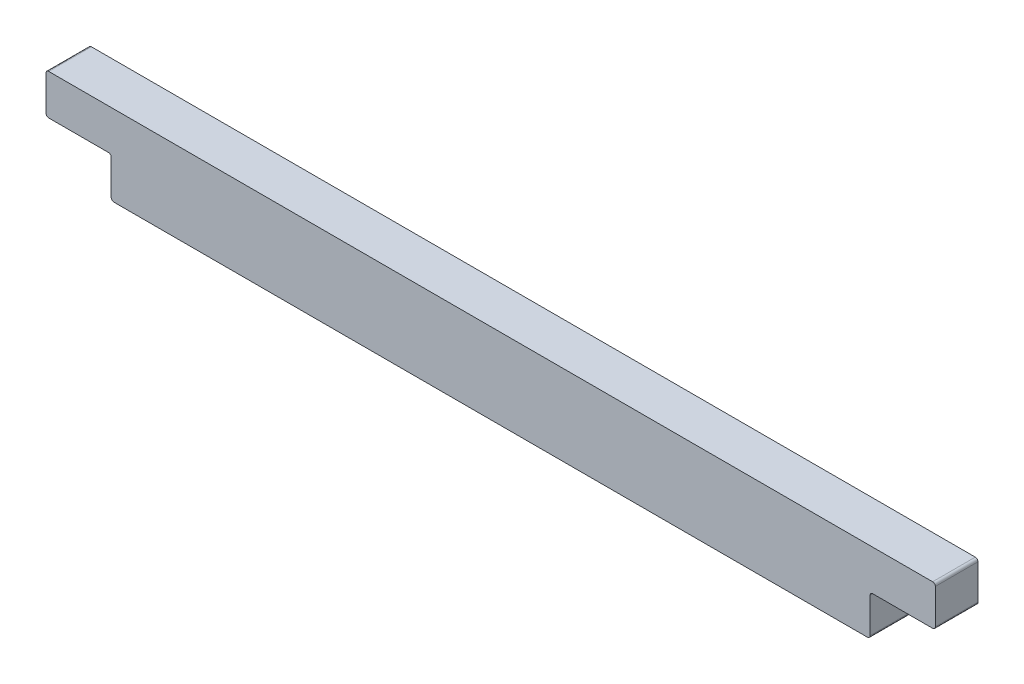
ISO-10303-21;
HEADER;
FILE_DESCRIPTION(('STEP AP214'),'2;1');
FILE_NAME('part.step','',(''),(''),'','','');
FILE_SCHEMA(('AUTOMOTIVE_DESIGN { 1 0 10303 214 1 1 1 1 }'));
ENDSEC;
DATA;
#1=APPLICATION_CONTEXT('core data for automotive mechanical design processes');
#2=APPLICATION_PROTOCOL_DEFINITION('international standard','automotive_design',2000,#1);
#3=PRODUCT_CONTEXT('',#1,'mechanical');
#4=PRODUCT('Part','Part','',(#3));
#5=PRODUCT_RELATED_PRODUCT_CATEGORY('part','',(#4));
#6=PRODUCT_DEFINITION_FORMATION('','',#4);
#7=PRODUCT_DEFINITION_CONTEXT('part definition',#1,'design');
#8=PRODUCT_DEFINITION('design','',#6,#7);
#9=PRODUCT_DEFINITION_SHAPE('','',#8);
#10=(LENGTH_UNIT() NAMED_UNIT(*) SI_UNIT(.MILLI.,.METRE.));
#11=(NAMED_UNIT(*) PLANE_ANGLE_UNIT() SI_UNIT($,.RADIAN.));
#12=(NAMED_UNIT(*) SI_UNIT($,.STERADIAN.) SOLID_ANGLE_UNIT());
#13=UNCERTAINTY_MEASURE_WITH_UNIT(LENGTH_MEASURE(1.E-05),#10,'distance_accuracy_value','');
#14=(GEOMETRIC_REPRESENTATION_CONTEXT(3) GLOBAL_UNCERTAINTY_ASSIGNED_CONTEXT((#13)) GLOBAL_UNIT_ASSIGNED_CONTEXT((#10,
#11,#12)) REPRESENTATION_CONTEXT('',''));
#15=CARTESIAN_POINT('',(0.,0.,0.));
#16=DIRECTION('',(0.,0.,1.));
#17=DIRECTION('',(1.,0.,0.));
#18=AXIS2_PLACEMENT_3D('',#15,#16,#17);
#19=CARTESIAN_POINT('',(33.08,-3.,3.175));
#20=DIRECTION('',(-1.,0.,0.));
#21=DIRECTION('',(0.,0.,1.));
#22=AXIS2_PLACEMENT_3D('',#19,#20,#21);
#23=PLANE('',#22);
#24=DIRECTION('',(0.,1.,0.));
#25=VECTOR('',#24,1.);
#26=CARTESIAN_POINT('',(33.08,-3.,3.175));
#27=LINE('',#26,#25);
#28=CARTESIAN_POINT('',(33.08,0.199999999999999,3.175));
#29=VERTEX_POINT('',#28);
#30=CARTESIAN_POINT('',(33.08,2.8,3.175));
#31=VERTEX_POINT('',#30);
#32=EDGE_CURVE('E190',#29,#31,#27,.T.);
#33=ORIENTED_EDGE('',*,*,#32,.F.);
#34=DIRECTION('',(0.,0.,1.));
#35=VECTOR('',#34,1.);
#36=CARTESIAN_POINT('',(33.08,0.199999999999999,3.175));
#37=LINE('',#36,#35);
#38=CARTESIAN_POINT('',(33.08,0.199999999999999,0.));
#39=VERTEX_POINT('',#38);
#40=EDGE_CURVE('E256',#29,#39,#37,.F.);
#41=ORIENTED_EDGE('',*,*,#40,.T.);
#42=DIRECTION('',(0.,1.,0.));
#43=VECTOR('',#42,1.);
#44=CARTESIAN_POINT('',(33.08,-3.,0.));
#45=LINE('',#44,#43);
#46=CARTESIAN_POINT('',(33.08,2.8,0.));
#47=VERTEX_POINT('',#46);
#48=EDGE_CURVE('E202',#39,#47,#45,.T.);
#49=ORIENTED_EDGE('',*,*,#48,.T.);
#50=DIRECTION('',(0.,0.,-1.));
#51=VECTOR('',#50,1.);
#52=CARTESIAN_POINT('',(33.08,2.8,3.175));
#53=LINE('',#52,#51);
#54=EDGE_CURVE('E254',#47,#31,#53,.F.);
#55=ORIENTED_EDGE('',*,*,#54,.T.);
#56=EDGE_LOOP('',(#33,#41,#49,#55));
#57=FACE_BOUND('',#56,.T.);
#58=ADVANCED_FACE('F33',(#57),#23,.F.);
#59=CARTESIAN_POINT('',(-33.08,3.,3.175));
#60=DIRECTION('',(0.,-1.,0.));
#61=DIRECTION('',(0.,0.,-1.));
#62=AXIS2_PLACEMENT_3D('',#59,#60,#61);
#63=PLANE('',#62);
#64=DIRECTION('',(-1.,0.,0.));
#65=VECTOR('',#64,1.);
#66=CARTESIAN_POINT('',(-33.08,3.,3.175));
#67=LINE('',#66,#65);
#68=CARTESIAN_POINT('',(32.88,3.,3.175));
#69=VERTEX_POINT('',#68);
#70=CARTESIAN_POINT('',(-32.88,3.,3.175));
#71=VERTEX_POINT('',#70);
#72=EDGE_CURVE('E193',#69,#71,#67,.T.);
#73=ORIENTED_EDGE('',*,*,#72,.F.);
#74=DIRECTION('',(0.,0.,-1.));
#75=VECTOR('',#74,1.);
#76=CARTESIAN_POINT('',(32.88,3.,3.175));
#77=LINE('',#76,#75);
#78=CARTESIAN_POINT('',(32.88,3.,0.));
#79=VERTEX_POINT('',#78);
#80=EDGE_CURVE('E260',#69,#79,#77,.T.);
#81=ORIENTED_EDGE('',*,*,#80,.T.);
#82=DIRECTION('',(-1.,0.,0.));
#83=VECTOR('',#82,1.);
#84=CARTESIAN_POINT('',(-33.08,3.,0.));
#85=LINE('',#84,#83);
#86=CARTESIAN_POINT('',(-32.88,3.,0.));
#87=VERTEX_POINT('',#86);
#88=EDGE_CURVE('E205',#79,#87,#85,.T.);
#89=ORIENTED_EDGE('',*,*,#88,.T.);
#90=DIRECTION('',(0.,0.,-1.));
#91=VECTOR('',#90,1.);
#92=CARTESIAN_POINT('',(-32.88,3.,3.175));
#93=LINE('',#92,#91);
#94=EDGE_CURVE('E258',#87,#71,#93,.F.);
#95=ORIENTED_EDGE('',*,*,#94,.T.);
#96=EDGE_LOOP('',(#73,#81,#89,#95));
#97=FACE_BOUND('',#96,.T.);
#98=ADVANCED_FACE('F311',(#97),#63,.F.);
#99=CARTESIAN_POINT('',(-33.08,-3.,3.175));
#100=DIRECTION('',(1.,0.,0.));
#101=DIRECTION('',(0.,0.,-1.));
#102=AXIS2_PLACEMENT_3D('',#99,#100,#101);
#103=PLANE('',#102);
#104=DIRECTION('',(0.,-1.,0.));
#105=VECTOR('',#104,1.);
#106=CARTESIAN_POINT('',(-33.08,-3.,3.175));
#107=LINE('',#106,#105);
#108=CARTESIAN_POINT('',(-33.08,2.8,3.175));
#109=VERTEX_POINT('',#108);
#110=CARTESIAN_POINT('',(-33.08,0.2,3.175));
#111=VERTEX_POINT('',#110);
#112=EDGE_CURVE('E197',#109,#111,#107,.T.);
#113=ORIENTED_EDGE('',*,*,#112,.F.);
#114=DIRECTION('',(0.,0.,-1.));
#115=VECTOR('',#114,1.);
#116=CARTESIAN_POINT('',(-33.08,2.8,3.175));
#117=LINE('',#116,#115);
#118=CARTESIAN_POINT('',(-33.08,2.8,0.));
#119=VERTEX_POINT('',#118);
#120=EDGE_CURVE('E157',#109,#119,#117,.T.);
#121=ORIENTED_EDGE('',*,*,#120,.T.);
#122=DIRECTION('',(0.,-1.,0.));
#123=VECTOR('',#122,1.);
#124=CARTESIAN_POINT('',(-33.08,-3.,0.));
#125=LINE('',#124,#123);
#126=CARTESIAN_POINT('',(-33.08,0.2,0.));
#127=VERTEX_POINT('',#126);
#128=EDGE_CURVE('E208',#119,#127,#125,.T.);
#129=ORIENTED_EDGE('',*,*,#128,.T.);
#130=DIRECTION('',(0.,0.,1.));
#131=VECTOR('',#130,1.);
#132=CARTESIAN_POINT('',(-33.08,0.2,3.175));
#133=LINE('',#132,#131);
#134=EDGE_CURVE('E263',#127,#111,#133,.T.);
#135=ORIENTED_EDGE('',*,*,#134,.T.);
#136=EDGE_LOOP('',(#113,#121,#129,#135));
#137=FACE_BOUND('',#136,.T.);
#138=ADVANCED_FACE('F302',(#137),#103,.F.);
#139=CARTESIAN_POINT('',(-33.08,-3.,3.175));
#140=DIRECTION('',(0.,1.,0.));
#141=DIRECTION('',(0.,0.,1.));
#142=AXIS2_PLACEMENT_3D('',#139,#140,#141);
#143=PLANE('',#142);
#144=DIRECTION('',(1.,0.,0.));
#145=VECTOR('',#144,1.);
#146=CARTESIAN_POINT('',(-33.08,-3.,3.175));
#147=LINE('',#146,#145);
#148=CARTESIAN_POINT('',(-28.03,-3.,3.175));
#149=VERTEX_POINT('',#148);
#150=CARTESIAN_POINT('',(28.03,-3.,3.175));
#151=VERTEX_POINT('',#150);
#152=EDGE_CURVE('E199',#149,#151,#147,.T.);
#153=ORIENTED_EDGE('',*,*,#152,.F.);
#154=DIRECTION('',(0.,0.,1.));
#155=VECTOR('',#154,1.);
#156=CARTESIAN_POINT('',(-28.03,-3.,3.175));
#157=LINE('',#156,#155);
#158=CARTESIAN_POINT('',(-28.03,-3.,0.));
#159=VERTEX_POINT('',#158);
#160=EDGE_CURVE('E231',#149,#159,#157,.F.);
#161=ORIENTED_EDGE('',*,*,#160,.T.);
#162=DIRECTION('',(1.,0.,0.));
#163=VECTOR('',#162,1.);
#164=CARTESIAN_POINT('',(-33.08,-3.,0.));
#165=LINE('',#164,#163);
#166=CARTESIAN_POINT('',(28.03,-3.,0.));
#167=VERTEX_POINT('',#166);
#168=EDGE_CURVE('E194',#159,#167,#165,.T.);
#169=ORIENTED_EDGE('',*,*,#168,.T.);
#170=DIRECTION('',(0.,0.,1.));
#171=VECTOR('',#170,1.);
#172=CARTESIAN_POINT('',(28.03,-3.,3.175));
#173=LINE('',#172,#171);
#174=EDGE_CURVE('E228',#167,#151,#173,.T.);
#175=ORIENTED_EDGE('',*,*,#174,.T.);
#176=EDGE_LOOP('',(#153,#161,#169,#175));
#177=FACE_BOUND('',#176,.T.);
#178=ADVANCED_FACE('F286',(#177),#143,.F.);
#179=CARTESIAN_POINT('',(0.,0.,3.175));
#180=DIRECTION('',(0.,0.,-1.));
#181=DIRECTION('',(-1.,0.,0.));
#182=AXIS2_PLACEMENT_3D('',#179,#180,#181);
#183=PLANE('',#182);
#184=DIRECTION('',(0.,1.,0.));
#185=VECTOR('',#184,1.);
#186=CARTESIAN_POINT('',(-28.23,-3.,3.175));
#187=LINE('',#186,#185);
#188=CARTESIAN_POINT('',(-28.23,-2.8,3.175));
#189=VERTEX_POINT('',#188);
#190=CARTESIAN_POINT('',(-28.23,-0.200000000000001,3.175));
#191=VERTEX_POINT('',#190);
#192=EDGE_CURVE('E174',#189,#191,#187,.T.);
#193=ORIENTED_EDGE('',*,*,#192,.F.);
#194=CARTESIAN_POINT('',(-28.03,-2.8,3.175));
#195=DIRECTION('',(0.,0.,-1.));
#196=DIRECTION('',(-1.,0.,0.));
#197=AXIS2_PLACEMENT_3D('',#194,#195,#196);
#198=CIRCLE('',#197,0.2);
#199=EDGE_CURVE('E226',#189,#149,#198,.F.);
#200=ORIENTED_EDGE('',*,*,#199,.T.);
#201=ORIENTED_EDGE('',*,*,#152,.T.);
#202=CARTESIAN_POINT('',(28.03,-2.8,3.175));
#203=DIRECTION('',(0.,0.,-1.));
#204=DIRECTION('',(-1.,0.,0.));
#205=AXIS2_PLACEMENT_3D('',#202,#203,#204);
#206=CIRCLE('',#205,0.2);
#207=CARTESIAN_POINT('',(28.23,-2.8,3.175));
#208=VERTEX_POINT('',#207);
#209=EDGE_CURVE('E217',#151,#208,#206,.F.);
#210=ORIENTED_EDGE('',*,*,#209,.T.);
#211=DIRECTION('',(0.,-1.,0.));
#212=VECTOR('',#211,1.);
#213=CARTESIAN_POINT('',(28.23,-3.,3.175));
#214=LINE('',#213,#212);
#215=CARTESIAN_POINT('',(28.23,-0.200000000000001,3.175));
#216=VERTEX_POINT('',#215);
#217=EDGE_CURVE('E184',#216,#208,#214,.T.);
#218=ORIENTED_EDGE('',*,*,#217,.F.);
#219=CARTESIAN_POINT('',(28.43,-0.200000000000001,3.175));
#220=DIRECTION('',(0.,0.,-1.));
#221=DIRECTION('',(-1.,0.,0.));
#222=AXIS2_PLACEMENT_3D('',#219,#220,#221);
#223=CIRCLE('',#222,0.2);
#224=CARTESIAN_POINT('',(28.43,0.,3.175));
#225=VERTEX_POINT('',#224);
#226=EDGE_CURVE('E41',#216,#225,#223,.T.);
#227=ORIENTED_EDGE('',*,*,#226,.T.);
#228=DIRECTION('',(-1.,0.,0.));
#229=VECTOR('',#228,1.);
#230=CARTESIAN_POINT('',(33.08,0.,3.175));
#231=LINE('',#230,#229);
#232=CARTESIAN_POINT('',(32.88,0.,3.175));
#233=VERTEX_POINT('',#232);
#234=EDGE_CURVE('E186',#233,#225,#231,.T.);
#235=ORIENTED_EDGE('',*,*,#234,.F.);
#236=CARTESIAN_POINT('',(32.88,0.199999999999999,3.175));
#237=DIRECTION('',(0.,0.,-1.));
#238=DIRECTION('',(-1.,0.,0.));
#239=AXIS2_PLACEMENT_3D('',#236,#237,#238);
#240=CIRCLE('',#239,0.2);
#241=EDGE_CURVE('E224',#233,#29,#240,.F.);
#242=ORIENTED_EDGE('',*,*,#241,.T.);
#243=ORIENTED_EDGE('',*,*,#32,.T.);
#244=CARTESIAN_POINT('',(32.88,2.8,3.175));
#245=DIRECTION('',(0.,0.,-1.));
#246=DIRECTION('',(-1.,0.,0.));
#247=AXIS2_PLACEMENT_3D('',#244,#245,#246);
#248=CIRCLE('',#247,0.2);
#249=EDGE_CURVE('E222',#31,#69,#248,.F.);
#250=ORIENTED_EDGE('',*,*,#249,.T.);
#251=ORIENTED_EDGE('',*,*,#72,.T.);
#252=CARTESIAN_POINT('',(-32.88,2.8,3.175));
#253=DIRECTION('',(0.,0.,-1.));
#254=DIRECTION('',(-1.,0.,0.));
#255=AXIS2_PLACEMENT_3D('',#252,#253,#254);
#256=CIRCLE('',#255,0.2);
#257=EDGE_CURVE('E220',#71,#109,#256,.F.);
#258=ORIENTED_EDGE('',*,*,#257,.T.);
#259=ORIENTED_EDGE('',*,*,#112,.T.);
#260=CARTESIAN_POINT('',(-32.88,0.2,3.175));
#261=DIRECTION('',(0.,0.,-1.));
#262=DIRECTION('',(-1.,0.,0.));
#263=AXIS2_PLACEMENT_3D('',#260,#261,#262);
#264=CIRCLE('',#263,0.2);
#265=CARTESIAN_POINT('',(-32.88,0.,3.175));
#266=VERTEX_POINT('',#265);
#267=EDGE_CURVE('E172',#111,#266,#264,.F.);
#268=ORIENTED_EDGE('',*,*,#267,.T.);
#269=DIRECTION('',(-1.,0.,0.));
#270=VECTOR('',#269,1.);
#271=CARTESIAN_POINT('',(-33.08,0.,3.175));
#272=LINE('',#271,#270);
#273=CARTESIAN_POINT('',(-28.43,0.,3.175));
#274=VERTEX_POINT('',#273);
#275=EDGE_CURVE('E163',#274,#266,#272,.T.);
#276=ORIENTED_EDGE('',*,*,#275,.F.);
#277=CARTESIAN_POINT('',(-28.43,-0.2,3.175));
#278=DIRECTION('',(0.,0.,-1.));
#279=DIRECTION('',(-1.,0.,0.));
#280=AXIS2_PLACEMENT_3D('',#277,#278,#279);
#281=CIRCLE('',#280,0.2);
#282=EDGE_CURVE('E146',#274,#191,#281,.T.);
#283=ORIENTED_EDGE('',*,*,#282,.T.);
#284=EDGE_LOOP('',(#193,#200,#201,#210,#218,#227,#235,#242,#243,#250,#251,#258,#259,#268,#276,#283));
#285=FACE_BOUND('',#284,.T.);
#286=ADVANCED_FACE('F170',(#285),#183,.F.);
#287=CARTESIAN_POINT('',(0.,0.,0.));
#288=DIRECTION('',(0.,0.,-1.));
#289=DIRECTION('',(-1.,0.,0.));
#290=AXIS2_PLACEMENT_3D('',#287,#288,#289);
#291=PLANE('',#290);
#292=ORIENTED_EDGE('',*,*,#168,.F.);
#293=CARTESIAN_POINT('',(-28.03,-2.8,0.));
#294=DIRECTION('',(0.,0.,-1.));
#295=DIRECTION('',(-1.,0.,0.));
#296=AXIS2_PLACEMENT_3D('',#293,#294,#295);
#297=CIRCLE('',#296,0.2);
#298=CARTESIAN_POINT('',(-28.23,-2.8,0.));
#299=VERTEX_POINT('',#298);
#300=EDGE_CURVE('E243',#159,#299,#297,.T.);
#301=ORIENTED_EDGE('',*,*,#300,.T.);
#302=DIRECTION('',(0.,1.,0.));
#303=VECTOR('',#302,1.);
#304=CARTESIAN_POINT('',(-28.23,-3.,0.));
#305=LINE('',#304,#303);
#306=CARTESIAN_POINT('',(-28.23,-0.200000000000001,0.));
#307=VERTEX_POINT('',#306);
#308=EDGE_CURVE('E173',#299,#307,#305,.T.);
#309=ORIENTED_EDGE('',*,*,#308,.T.);
#310=CARTESIAN_POINT('',(-28.43,-0.2,0.));
#311=DIRECTION('',(0.,0.,-1.));
#312=DIRECTION('',(-1.,0.,0.));
#313=AXIS2_PLACEMENT_3D('',#310,#311,#312);
#314=CIRCLE('',#313,0.2);
#315=CARTESIAN_POINT('',(-28.43,0.,0.));
#316=VERTEX_POINT('',#315);
#317=EDGE_CURVE('E156',#307,#316,#314,.F.);
#318=ORIENTED_EDGE('',*,*,#317,.T.);
#319=DIRECTION('',(-1.,0.,0.));
#320=VECTOR('',#319,1.);
#321=CARTESIAN_POINT('',(-33.08,0.,0.));
#322=LINE('',#321,#320);
#323=CARTESIAN_POINT('',(-32.88,0.,0.));
#324=VERTEX_POINT('',#323);
#325=EDGE_CURVE('E166',#316,#324,#322,.T.);
#326=ORIENTED_EDGE('',*,*,#325,.T.);
#327=CARTESIAN_POINT('',(-32.88,0.2,0.));
#328=DIRECTION('',(0.,0.,-1.));
#329=DIRECTION('',(-1.,0.,0.));
#330=AXIS2_PLACEMENT_3D('',#327,#328,#329);
#331=CIRCLE('',#330,0.2);
#332=EDGE_CURVE('E235',#324,#127,#331,.T.);
#333=ORIENTED_EDGE('',*,*,#332,.T.);
#334=ORIENTED_EDGE('',*,*,#128,.F.);
#335=CARTESIAN_POINT('',(-32.88,2.8,0.));
#336=DIRECTION('',(0.,0.,-1.));
#337=DIRECTION('',(-1.,0.,0.));
#338=AXIS2_PLACEMENT_3D('',#335,#336,#337);
#339=CIRCLE('',#338,0.2);
#340=EDGE_CURVE('E237',#119,#87,#339,.T.);
#341=ORIENTED_EDGE('',*,*,#340,.T.);
#342=ORIENTED_EDGE('',*,*,#88,.F.);
#343=CARTESIAN_POINT('',(32.88,2.8,0.));
#344=DIRECTION('',(0.,0.,-1.));
#345=DIRECTION('',(-1.,0.,0.));
#346=AXIS2_PLACEMENT_3D('',#343,#344,#345);
#347=CIRCLE('',#346,0.2);
#348=EDGE_CURVE('E239',#79,#47,#347,.T.);
#349=ORIENTED_EDGE('',*,*,#348,.T.);
#350=ORIENTED_EDGE('',*,*,#48,.F.);
#351=CARTESIAN_POINT('',(32.88,0.199999999999999,0.));
#352=DIRECTION('',(0.,0.,-1.));
#353=DIRECTION('',(-1.,0.,0.));
#354=AXIS2_PLACEMENT_3D('',#351,#352,#353);
#355=CIRCLE('',#354,0.2);
#356=CARTESIAN_POINT('',(32.88,0.,0.));
#357=VERTEX_POINT('',#356);
#358=EDGE_CURVE('E241',#39,#357,#355,.T.);
#359=ORIENTED_EDGE('',*,*,#358,.T.);
#360=DIRECTION('',(-1.,0.,0.));
#361=VECTOR('',#360,1.);
#362=CARTESIAN_POINT('',(33.08,0.,0.));
#363=LINE('',#362,#361);
#364=CARTESIAN_POINT('',(28.43,0.,0.));
#365=VERTEX_POINT('',#364);
#366=EDGE_CURVE('E182',#357,#365,#363,.T.);
#367=ORIENTED_EDGE('',*,*,#366,.T.);
#368=CARTESIAN_POINT('',(28.43,-0.200000000000001,0.));
#369=DIRECTION('',(0.,0.,-1.));
#370=DIRECTION('',(-1.,0.,0.));
#371=AXIS2_PLACEMENT_3D('',#368,#369,#370);
#372=CIRCLE('',#371,0.2);
#373=CARTESIAN_POINT('',(28.23,-0.200000000000001,0.));
#374=VERTEX_POINT('',#373);
#375=EDGE_CURVE('E11',#365,#374,#372,.F.);
#376=ORIENTED_EDGE('',*,*,#375,.T.);
#377=DIRECTION('',(0.,-1.,0.));
#378=VECTOR('',#377,1.);
#379=CARTESIAN_POINT('',(28.23,-3.,0.));
#380=LINE('',#379,#378);
#381=CARTESIAN_POINT('',(28.23,-2.8,0.));
#382=VERTEX_POINT('',#381);
#383=EDGE_CURVE('E178',#374,#382,#380,.T.);
#384=ORIENTED_EDGE('',*,*,#383,.T.);
#385=CARTESIAN_POINT('',(28.03,-2.8,0.));
#386=DIRECTION('',(0.,0.,-1.));
#387=DIRECTION('',(-1.,0.,0.));
#388=AXIS2_PLACEMENT_3D('',#385,#386,#387);
#389=CIRCLE('',#388,0.2);
#390=EDGE_CURVE('E233',#382,#167,#389,.T.);
#391=ORIENTED_EDGE('',*,*,#390,.T.);
#392=EDGE_LOOP('',(#292,#301,#309,#318,#326,#333,#334,#341,#342,#349,#350,#359,#367,#376,#384,#391));
#393=FACE_BOUND('',#392,.T.);
#394=ADVANCED_FACE('F281',(#393),#291,.T.);
#395=CARTESIAN_POINT('',(28.23,-3.,0.));
#396=DIRECTION('',(-1.,0.,0.));
#397=DIRECTION('',(0.,0.,1.));
#398=AXIS2_PLACEMENT_3D('',#395,#396,#397);
#399=PLANE('',#398);
#400=ORIENTED_EDGE('',*,*,#383,.F.);
#401=DIRECTION('',(0.,0.,1.));
#402=VECTOR('',#401,1.);
#403=CARTESIAN_POINT('',(28.23,-0.200000000000001,3.175));
#404=LINE('',#403,#402);
#405=EDGE_CURVE('E246',#374,#216,#404,.T.);
#406=ORIENTED_EDGE('',*,*,#405,.T.);
#407=ORIENTED_EDGE('',*,*,#217,.T.);
#408=DIRECTION('',(0.,0.,1.));
#409=VECTOR('',#408,1.);
#410=CARTESIAN_POINT('',(28.23,-2.8,0.));
#411=LINE('',#410,#409);
#412=EDGE_CURVE('E48',#208,#382,#411,.F.);
#413=ORIENTED_EDGE('',*,*,#412,.T.);
#414=EDGE_LOOP('',(#400,#406,#407,#413));
#415=FACE_BOUND('',#414,.T.);
#416=ADVANCED_FACE('F278',(#415),#399,.F.);
#417=CARTESIAN_POINT('',(33.08,0.,0.));
#418=DIRECTION('',(0.,1.,0.));
#419=DIRECTION('',(-1.,0.,0.));
#420=AXIS2_PLACEMENT_3D('',#417,#418,#419);
#421=PLANE('',#420);
#422=ORIENTED_EDGE('',*,*,#234,.T.);
#423=DIRECTION('',(0.,0.,1.));
#424=VECTOR('',#423,1.);
#425=CARTESIAN_POINT('',(28.43,0.,0.));
#426=LINE('',#425,#424);
#427=EDGE_CURVE('E252',#225,#365,#426,.F.);
#428=ORIENTED_EDGE('',*,*,#427,.T.);
#429=ORIENTED_EDGE('',*,*,#366,.F.);
#430=DIRECTION('',(0.,0.,1.));
#431=VECTOR('',#430,1.);
#432=CARTESIAN_POINT('',(32.88,0.,0.));
#433=LINE('',#432,#431);
#434=EDGE_CURVE('E249',#357,#233,#433,.T.);
#435=ORIENTED_EDGE('',*,*,#434,.T.);
#436=EDGE_LOOP('',(#422,#428,#429,#435));
#437=FACE_BOUND('',#436,.T.);
#438=ADVANCED_FACE('F274',(#437),#421,.F.);
#439=CARTESIAN_POINT('',(-33.08,0.,0.));
#440=DIRECTION('',(0.,1.,0.));
#441=DIRECTION('',(-1.,0.,0.));
#442=AXIS2_PLACEMENT_3D('',#439,#440,#441);
#443=PLANE('',#442);
#444=ORIENTED_EDGE('',*,*,#325,.F.);
#445=DIRECTION('',(0.,0.,1.));
#446=VECTOR('',#445,1.);
#447=CARTESIAN_POINT('',(-28.43,0.,3.175));
#448=LINE('',#447,#446);
#449=EDGE_CURVE('E150',#316,#274,#448,.T.);
#450=ORIENTED_EDGE('',*,*,#449,.T.);
#451=ORIENTED_EDGE('',*,*,#275,.T.);
#452=DIRECTION('',(0.,0.,1.));
#453=VECTOR('',#452,1.);
#454=CARTESIAN_POINT('',(-32.88,0.,0.));
#455=LINE('',#454,#453);
#456=EDGE_CURVE('E168',#266,#324,#455,.F.);
#457=ORIENTED_EDGE('',*,*,#456,.T.);
#458=EDGE_LOOP('',(#444,#450,#451,#457));
#459=FACE_BOUND('',#458,.T.);
#460=ADVANCED_FACE('F162',(#459),#443,.F.);
#461=CARTESIAN_POINT('',(-28.23,-3.,0.));
#462=DIRECTION('',(1.,0.,0.));
#463=DIRECTION('',(0.,0.,-1.));
#464=AXIS2_PLACEMENT_3D('',#461,#462,#463);
#465=PLANE('',#464);
#466=ORIENTED_EDGE('',*,*,#192,.T.);
#467=DIRECTION('',(0.,0.,1.));
#468=VECTOR('',#467,1.);
#469=CARTESIAN_POINT('',(-28.23,-0.2,0.));
#470=LINE('',#469,#468);
#471=EDGE_CURVE('E151',#191,#307,#470,.F.);
#472=ORIENTED_EDGE('',*,*,#471,.T.);
#473=ORIENTED_EDGE('',*,*,#308,.F.);
#474=DIRECTION('',(0.,0.,1.));
#475=VECTOR('',#474,1.);
#476=CARTESIAN_POINT('',(-28.23,-2.8,0.));
#477=LINE('',#476,#475);
#478=EDGE_CURVE('E167',#299,#189,#477,.T.);
#479=ORIENTED_EDGE('',*,*,#478,.T.);
#480=EDGE_LOOP('',(#466,#472,#473,#479));
#481=FACE_BOUND('',#480,.T.);
#482=ADVANCED_FACE('F294',(#481),#465,.F.);
#483=CARTESIAN_POINT('',(-28.43,-0.2,0.));
#484=DIRECTION('',(0.,0.,-1.));
#485=DIRECTION('',(-1.,0.,0.));
#486=AXIS2_PLACEMENT_3D('',#483,#484,#485);
#487=CYLINDRICAL_SURFACE('',#486,0.2);
#488=ORIENTED_EDGE('',*,*,#317,.F.);
#489=ORIENTED_EDGE('',*,*,#471,.F.);
#490=ORIENTED_EDGE('',*,*,#282,.F.);
#491=ORIENTED_EDGE('',*,*,#449,.F.);
#492=EDGE_LOOP('',(#488,#489,#490,#491));
#493=FACE_BOUND('',#492,.T.);
#494=ADVANCED_FACE('F149',(#493),#487,.F.);
#495=CARTESIAN_POINT('',(-28.03,-2.8,0.));
#496=DIRECTION('',(0.,0.,1.));
#497=DIRECTION('',(1.,0.,0.));
#498=AXIS2_PLACEMENT_3D('',#495,#496,#497);
#499=CYLINDRICAL_SURFACE('',#498,0.2);
#500=ORIENTED_EDGE('',*,*,#300,.F.);
#501=ORIENTED_EDGE('',*,*,#160,.F.);
#502=ORIENTED_EDGE('',*,*,#199,.F.);
#503=ORIENTED_EDGE('',*,*,#478,.F.);
#504=EDGE_LOOP('',(#500,#501,#502,#503));
#505=FACE_BOUND('',#504,.T.);
#506=ADVANCED_FACE('F291',(#505),#499,.T.);
#507=CARTESIAN_POINT('',(28.43,-0.200000000000001,0.));
#508=DIRECTION('',(0.,0.,-1.));
#509=DIRECTION('',(-1.,0.,0.));
#510=AXIS2_PLACEMENT_3D('',#507,#508,#509);
#511=CYLINDRICAL_SURFACE('',#510,0.2);
#512=ORIENTED_EDGE('',*,*,#375,.F.);
#513=ORIENTED_EDGE('',*,*,#427,.F.);
#514=ORIENTED_EDGE('',*,*,#226,.F.);
#515=ORIENTED_EDGE('',*,*,#405,.F.);
#516=EDGE_LOOP('',(#512,#513,#514,#515));
#517=FACE_BOUND('',#516,.T.);
#518=ADVANCED_FACE('F277',(#517),#511,.F.);
#519=CARTESIAN_POINT('',(32.88,0.199999999999999,0.));
#520=DIRECTION('',(0.,0.,1.));
#521=DIRECTION('',(1.,0.,0.));
#522=AXIS2_PLACEMENT_3D('',#519,#520,#521);
#523=CYLINDRICAL_SURFACE('',#522,0.2);
#524=ORIENTED_EDGE('',*,*,#358,.F.);
#525=ORIENTED_EDGE('',*,*,#40,.F.);
#526=ORIENTED_EDGE('',*,*,#241,.F.);
#527=ORIENTED_EDGE('',*,*,#434,.F.);
#528=EDGE_LOOP('',(#524,#525,#526,#527));
#529=FACE_BOUND('',#528,.T.);
#530=ADVANCED_FACE('F323',(#529),#523,.T.);
#531=CARTESIAN_POINT('',(32.88,2.8,3.175));
#532=DIRECTION('',(0.,0.,-1.));
#533=DIRECTION('',(-1.,0.,0.));
#534=AXIS2_PLACEMENT_3D('',#531,#532,#533);
#535=CYLINDRICAL_SURFACE('',#534,0.2);
#536=ORIENTED_EDGE('',*,*,#249,.F.);
#537=ORIENTED_EDGE('',*,*,#54,.F.);
#538=ORIENTED_EDGE('',*,*,#348,.F.);
#539=ORIENTED_EDGE('',*,*,#80,.F.);
#540=EDGE_LOOP('',(#536,#537,#538,#539));
#541=FACE_BOUND('',#540,.T.);
#542=ADVANCED_FACE('F315',(#541),#535,.T.);
#543=CARTESIAN_POINT('',(-32.88,2.8,3.175));
#544=DIRECTION('',(0.,0.,-1.));
#545=DIRECTION('',(-1.,0.,0.));
#546=AXIS2_PLACEMENT_3D('',#543,#544,#545);
#547=CYLINDRICAL_SURFACE('',#546,0.2);
#548=ORIENTED_EDGE('',*,*,#257,.F.);
#549=ORIENTED_EDGE('',*,*,#94,.F.);
#550=ORIENTED_EDGE('',*,*,#340,.F.);
#551=ORIENTED_EDGE('',*,*,#120,.F.);
#552=EDGE_LOOP('',(#548,#549,#550,#551));
#553=FACE_BOUND('',#552,.T.);
#554=ADVANCED_FACE('F308',(#553),#547,.T.);
#555=CARTESIAN_POINT('',(-32.88,0.2,3.175));
#556=DIRECTION('',(0.,0.,1.));
#557=DIRECTION('',(1.,0.,0.));
#558=AXIS2_PLACEMENT_3D('',#555,#556,#557);
#559=CYLINDRICAL_SURFACE('',#558,0.2);
#560=ORIENTED_EDGE('',*,*,#332,.F.);
#561=ORIENTED_EDGE('',*,*,#456,.F.);
#562=ORIENTED_EDGE('',*,*,#267,.F.);
#563=ORIENTED_EDGE('',*,*,#134,.F.);
#564=EDGE_LOOP('',(#560,#561,#562,#563));
#565=FACE_BOUND('',#564,.T.);
#566=ADVANCED_FACE('F299',(#565),#559,.T.);
#567=CARTESIAN_POINT('',(28.03,-2.8,3.175));
#568=DIRECTION('',(0.,0.,1.));
#569=DIRECTION('',(1.,0.,0.));
#570=AXIS2_PLACEMENT_3D('',#567,#568,#569);
#571=CYLINDRICAL_SURFACE('',#570,0.2);
#572=ORIENTED_EDGE('',*,*,#390,.F.);
#573=ORIENTED_EDGE('',*,*,#412,.F.);
#574=ORIENTED_EDGE('',*,*,#209,.F.);
#575=ORIENTED_EDGE('',*,*,#174,.F.);
#576=EDGE_LOOP('',(#572,#573,#574,#575));
#577=FACE_BOUND('',#576,.T.);
#578=ADVANCED_FACE('F35',(#577),#571,.T.);
#579=CLOSED_SHELL('',(#58,#98,#138,#178,#286,#394,#416,#438,#460,#482,#494,#506,#518,#530,#542,
#554,#566,#578));
#580=MANIFOLD_SOLID_BREP('B2',#579);
#581=ADVANCED_BREP_SHAPE_REPRESENTATION('',(#18,#580),#14);
#582=SHAPE_DEFINITION_REPRESENTATION(#9,#581);
ENDSEC;
END-ISO-10303-21;
